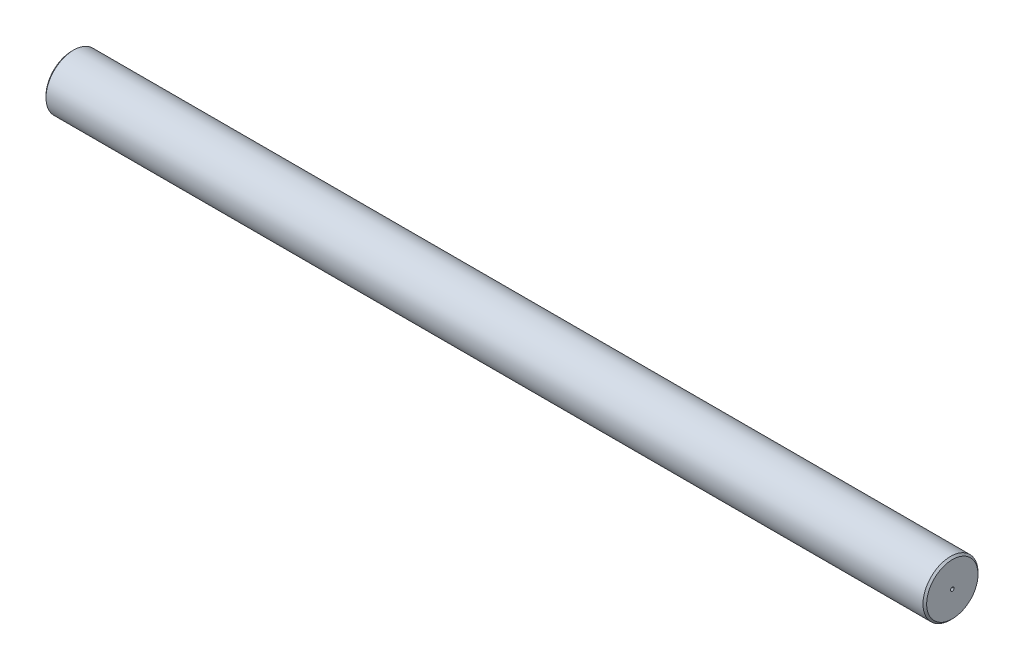
ISO-10303-21;
HEADER;
FILE_DESCRIPTION(('STEP AP214'),'2;1');
FILE_NAME('part.step','',(''),(''),'','','');
FILE_SCHEMA(('AUTOMOTIVE_DESIGN { 1 0 10303 214 1 1 1 1 }'));
ENDSEC;
DATA;
#1=APPLICATION_CONTEXT('core data for automotive mechanical design processes');
#2=APPLICATION_PROTOCOL_DEFINITION('international standard','automotive_design',2000,#1);
#3=PRODUCT_CONTEXT('',#1,'mechanical');
#4=PRODUCT('Part','Part','',(#3));
#5=PRODUCT_RELATED_PRODUCT_CATEGORY('part','',(#4));
#6=PRODUCT_DEFINITION_FORMATION('','',#4);
#7=PRODUCT_DEFINITION_CONTEXT('part definition',#1,'design');
#8=PRODUCT_DEFINITION('design','',#6,#7);
#9=PRODUCT_DEFINITION_SHAPE('','',#8);
#10=(LENGTH_UNIT() NAMED_UNIT(*) SI_UNIT(.MILLI.,.METRE.));
#11=(NAMED_UNIT(*) PLANE_ANGLE_UNIT() SI_UNIT($,.RADIAN.));
#12=(NAMED_UNIT(*) SI_UNIT($,.STERADIAN.) SOLID_ANGLE_UNIT());
#13=UNCERTAINTY_MEASURE_WITH_UNIT(LENGTH_MEASURE(1.E-05),#10,'distance_accuracy_value','');
#14=(GEOMETRIC_REPRESENTATION_CONTEXT(3) GLOBAL_UNCERTAINTY_ASSIGNED_CONTEXT((#13)) GLOBAL_UNIT_ASSIGNED_CONTEXT((#10,
#11,#12)) REPRESENTATION_CONTEXT('',''));
#15=CARTESIAN_POINT('',(0.,0.,0.));
#16=DIRECTION('',(0.,0.,1.));
#17=DIRECTION('',(1.,0.,0.));
#18=AXIS2_PLACEMENT_3D('',#15,#16,#17);
#19=CARTESIAN_POINT('',(240.,7.5,0.));
#20=DIRECTION('',(-1.,0.,0.));
#21=DIRECTION('',(0.,-1.,0.));
#22=AXIS2_PLACEMENT_3D('',#19,#20,#21);
#23=PLANE('',#22);
#24=CARTESIAN_POINT('',(240.,0.,0.));
#25=DIRECTION('',(-1.,0.,0.));
#26=DIRECTION('',(0.,-1.,0.));
#27=AXIS2_PLACEMENT_3D('',#24,#25,#26);
#28=CIRCLE('',#27,7.00000000000001);
#29=CARTESIAN_POINT('',(240.,-7.00000000000001,0.));
#30=VERTEX_POINT('',#29);
#31=EDGE_CURVE('E41',#30,#30,#28,.F.);
#32=ORIENTED_EDGE('',*,*,#31,.T.);
#33=EDGE_LOOP('',(#32));
#34=FACE_BOUND('',#33,.T.);
#35=CARTESIAN_POINT('',(240.,0.,0.));
#36=DIRECTION('',(-1.,0.,0.));
#37=DIRECTION('',(0.,0.,1.));
#38=AXIS2_PLACEMENT_3D('',#35,#36,#37);
#39=CIRCLE('',#38,0.5);
#40=CARTESIAN_POINT('',(240.,0.,0.5));
#41=VERTEX_POINT('',#40);
#42=EDGE_CURVE('E55',#41,#41,#39,.T.);
#43=ORIENTED_EDGE('',*,*,#42,.T.);
#44=EDGE_LOOP('',(#43));
#45=FACE_BOUND('',#44,.T.);
#46=ADVANCED_FACE('F33',(#34,#45),#23,.F.);
#47=CARTESIAN_POINT('',(0.,7.5,0.));
#48=DIRECTION('',(1.,0.,0.));
#49=DIRECTION('',(0.,1.,0.));
#50=AXIS2_PLACEMENT_3D('',#47,#48,#49);
#51=PLANE('',#50);
#52=CARTESIAN_POINT('',(0.,0.,0.));
#53=DIRECTION('',(1.,0.,0.));
#54=DIRECTION('',(0.,1.,0.));
#55=AXIS2_PLACEMENT_3D('',#52,#53,#54);
#56=CIRCLE('',#55,7.00000000000001);
#57=CARTESIAN_POINT('',(0.,7.00000000000001,0.));
#58=VERTEX_POINT('',#57);
#59=EDGE_CURVE('E11',#58,#58,#56,.F.);
#60=ORIENTED_EDGE('',*,*,#59,.T.);
#61=EDGE_LOOP('',(#60));
#62=FACE_BOUND('',#61,.T.);
#63=CARTESIAN_POINT('',(0.,0.,0.));
#64=DIRECTION('',(-1.,0.,0.));
#65=DIRECTION('',(0.,0.,1.));
#66=AXIS2_PLACEMENT_3D('',#63,#64,#65);
#67=CIRCLE('',#66,0.5);
#68=CARTESIAN_POINT('',(0.,0.,0.5));
#69=VERTEX_POINT('',#68);
#70=EDGE_CURVE('E57',#69,#69,#67,.T.);
#71=ORIENTED_EDGE('',*,*,#70,.F.);
#72=EDGE_LOOP('',(#71));
#73=FACE_BOUND('',#72,.T.);
#74=ADVANCED_FACE('F78',(#62,#73),#51,.F.);
#75=CARTESIAN_POINT('',(0.,0.,0.));
#76=DIRECTION('',(-1.,0.,0.));
#77=DIRECTION('',(0.,-1.,0.));
#78=AXIS2_PLACEMENT_3D('',#75,#76,#77);
#79=CYLINDRICAL_SURFACE('',#78,7.5);
#80=CARTESIAN_POINT('',(239.5,0.,0.));
#81=DIRECTION('',(-1.,0.,0.));
#82=DIRECTION('',(0.,-1.,0.));
#83=AXIS2_PLACEMENT_3D('',#80,#81,#82);
#84=CIRCLE('',#83,7.5);
#85=CARTESIAN_POINT('',(239.5,-7.5,0.));
#86=VERTEX_POINT('',#85);
#87=EDGE_CURVE('E65',#86,#86,#84,.T.);
#88=ORIENTED_EDGE('',*,*,#87,.T.);
#89=EDGE_LOOP('',(#88));
#90=FACE_BOUND('',#89,.T.);
#91=CARTESIAN_POINT('',(0.50000000000002,0.,0.));
#92=DIRECTION('',(1.,0.,0.));
#93=DIRECTION('',(0.,1.,0.));
#94=AXIS2_PLACEMENT_3D('',#91,#92,#93);
#95=CIRCLE('',#94,7.5);
#96=CARTESIAN_POINT('',(0.50000000000002,7.5,0.));
#97=VERTEX_POINT('',#96);
#98=EDGE_CURVE('E60',#97,#97,#95,.T.);
#99=ORIENTED_EDGE('',*,*,#98,.T.);
#100=EDGE_LOOP('',(#99));
#101=FACE_BOUND('',#100,.T.);
#102=ADVANCED_FACE('F75',(#90,#101),#79,.T.);
#103=CARTESIAN_POINT('',(0.5,0.,0.));
#104=DIRECTION('',(-1.,0.,0.));
#105=DIRECTION('',(0.,0.,1.));
#106=AXIS2_PLACEMENT_3D('',#103,#104,#105);
#107=CONICAL_SURFACE('',#106,0.,0.785398163397448);
#108=ORIENTED_EDGE('',*,*,#70,.T.);
#109=EDGE_LOOP('',(#108));
#110=FACE_BOUND('',#109,.T.);
#111=CARTESIAN_POINT('',(0.5,0.,0.));
#112=VERTEX_POINT('',#111);
#113=VERTEX_LOOP('',#112);
#114=FACE_BOUND('',#113,.T.);
#115=ADVANCED_FACE('F51',(#110,#114),#107,.F.);
#116=CARTESIAN_POINT('',(240.,0.,0.));
#117=DIRECTION('',(1.,0.,0.));
#118=DIRECTION('',(0.,0.,-1.));
#119=AXIS2_PLACEMENT_3D('',#116,#117,#118);
#120=CONICAL_SURFACE('',#119,0.5,0.785398163397448);
#121=CARTESIAN_POINT('',(239.5,0.,0.));
#122=VERTEX_POINT('',#121);
#123=VERTEX_LOOP('',#122);
#124=FACE_BOUND('',#123,.T.);
#125=ORIENTED_EDGE('',*,*,#42,.F.);
#126=EDGE_LOOP('',(#125));
#127=FACE_BOUND('',#126,.T.);
#128=ADVANCED_FACE('F47',(#124,#127),#120,.F.);
#129=CARTESIAN_POINT('',(239.5,0.,0.));
#130=DIRECTION('',(-1.,0.,0.));
#131=DIRECTION('',(0.,-1.,0.));
#132=AXIS2_PLACEMENT_3D('',#129,#130,#131);
#133=CONICAL_SURFACE('',#132,7.5,0.785398163397442);
#134=ORIENTED_EDGE('',*,*,#31,.F.);
#135=EDGE_LOOP('',(#134));
#136=FACE_BOUND('',#135,.T.);
#137=ORIENTED_EDGE('',*,*,#87,.F.);
#138=EDGE_LOOP('',(#137));
#139=FACE_BOUND('',#138,.T.);
#140=ADVANCED_FACE('F50',(#136,#139),#133,.T.);
#141=CARTESIAN_POINT('',(0.,0.,0.));
#142=DIRECTION('',(1.,0.,0.));
#143=DIRECTION('',(0.,1.,0.));
#144=AXIS2_PLACEMENT_3D('',#141,#142,#143);
#145=CONICAL_SURFACE('',#144,7.00000000000001,0.785398163397423);
#146=CARTESIAN_POINT('',(0.50000000000002,7.5,0.));
#147=CARTESIAN_POINT('',(0.494791666666686,7.49479166666667,0.));
#148=CARTESIAN_POINT('',(0.489583333333353,7.48958333333333,0.));
#149=CARTESIAN_POINT('',(0.479166666666686,7.47916666666667,0.));
#150=CARTESIAN_POINT('',(0.473958333333352,7.47395833333333,0.));
#151=CARTESIAN_POINT('',(0.463541666666685,7.46354166666667,0.));
#152=CARTESIAN_POINT('',(0.458333333333352,7.45833333333333,0.));
#153=CARTESIAN_POINT('',(0.447916666666685,7.44791666666667,0.));
#154=CARTESIAN_POINT('',(0.442708333333351,7.44270833333333,0.));
#155=CARTESIAN_POINT('',(0.432291666666684,7.43229166666667,0.));
#156=CARTESIAN_POINT('',(0.42708333333335,7.42708333333333,0.));
#157=CARTESIAN_POINT('',(0.416666666666683,7.41666666666667,0.));
#158=CARTESIAN_POINT('',(0.41145833333335,7.41145833333333,0.));
#159=CARTESIAN_POINT('',(0.401041666666683,7.40104166666667,0.));
#160=CARTESIAN_POINT('',(0.395833333333349,7.39583333333333,0.));
#161=CARTESIAN_POINT('',(0.385416666666682,7.38541666666667,0.));
#162=CARTESIAN_POINT('',(0.380208333333348,7.38020833333333,0.));
#163=CARTESIAN_POINT('',(0.369791666666681,7.36979166666667,0.));
#164=CARTESIAN_POINT('',(0.364583333333348,7.36458333333333,0.));
#165=CARTESIAN_POINT('',(0.354166666666681,7.35416666666667,0.));
#166=CARTESIAN_POINT('',(0.348958333333347,7.34895833333333,0.));
#167=CARTESIAN_POINT('',(0.33854166666668,7.33854166666667,0.));
#168=CARTESIAN_POINT('',(0.333333333333347,7.33333333333333,0.));
#169=CARTESIAN_POINT('',(0.322916666666679,7.32291666666667,0.));
#170=CARTESIAN_POINT('',(0.317708333333346,7.31770833333334,0.));
#171=CARTESIAN_POINT('',(0.307291666666679,7.30729166666667,0.));
#172=CARTESIAN_POINT('',(0.302083333333345,7.30208333333334,0.));
#173=CARTESIAN_POINT('',(0.291666666666678,7.29166666666667,0.));
#174=CARTESIAN_POINT('',(0.286458333333345,7.28645833333334,0.));
#175=CARTESIAN_POINT('',(0.276041666666678,7.27604166666667,0.));
#176=CARTESIAN_POINT('',(0.270833333333344,7.27083333333334,0.));
#177=CARTESIAN_POINT('',(0.260416666666677,7.26041666666667,0.));
#178=CARTESIAN_POINT('',(0.255208333333343,7.25520833333334,0.));
#179=CARTESIAN_POINT('',(0.244791666666676,7.24479166666667,0.));
#180=CARTESIAN_POINT('',(0.239583333333343,7.23958333333334,0.));
#181=CARTESIAN_POINT('',(0.229166666666676,7.22916666666667,0.));
#182=CARTESIAN_POINT('',(0.223958333333342,7.22395833333334,0.));
#183=CARTESIAN_POINT('',(0.213541666666675,7.21354166666667,0.));
#184=CARTESIAN_POINT('',(0.208333333333342,7.20833333333334,0.));
#185=CARTESIAN_POINT('',(0.197916666666675,7.19791666666667,0.));
#186=CARTESIAN_POINT('',(0.192708333333341,7.19270833333334,0.));
#187=CARTESIAN_POINT('',(0.182291666666674,7.18229166666667,0.));
#188=CARTESIAN_POINT('',(0.17708333333334,7.17708333333334,0.));
#189=CARTESIAN_POINT('',(0.166666666666673,7.16666666666667,0.));
#190=CARTESIAN_POINT('',(0.16145833333334,7.16145833333334,0.));
#191=CARTESIAN_POINT('',(0.151041666666673,7.15104166666667,0.));
#192=CARTESIAN_POINT('',(0.145833333333339,7.14583333333334,0.));
#193=CARTESIAN_POINT('',(0.135416666666672,7.13541666666667,0.));
#194=CARTESIAN_POINT('',(0.130208333333339,7.13020833333334,0.));
#195=CARTESIAN_POINT('',(0.119791666666672,7.11979166666667,0.));
#196=CARTESIAN_POINT('',(0.114583333333338,7.11458333333334,0.));
#197=CARTESIAN_POINT('',(0.104166666666671,7.10416666666667,0.));
#198=CARTESIAN_POINT('',(0.0989583333333374,7.09895833333334,0.));
#199=CARTESIAN_POINT('',(0.0885416666666703,7.08854166666667,0.));
#200=CARTESIAN_POINT('',(0.0833333333333368,7.08333333333334,0.));
#201=CARTESIAN_POINT('',(0.0729166666666697,7.07291666666667,0.));
#202=CARTESIAN_POINT('',(0.0677083333333361,7.06770833333334,0.));
#203=CARTESIAN_POINT('',(0.0572916666666691,7.05729166666667,0.));
#204=CARTESIAN_POINT('',(0.0520833333333356,7.05208333333334,0.));
#205=CARTESIAN_POINT('',(0.0416666666666685,7.04166666666667,0.));
#206=CARTESIAN_POINT('',(0.0364583333333349,7.03645833333334,0.));
#207=CARTESIAN_POINT('',(0.0260416666666677,7.02604166666667,0.));
#208=CARTESIAN_POINT('',(0.0208333333333343,7.02083333333334,0.));
#209=CARTESIAN_POINT('',(0.0104166666666673,7.01041666666667,0.));
#210=CARTESIAN_POINT('',(0.00520833333333378,7.00520833333334,0.));
#211=CARTESIAN_POINT('',(0.,7.00000000000001,0.));
#212=B_SPLINE_CURVE_WITH_KNOTS('',3,(#146,#147,#148,#149,#150,#151,#152,#153,#154,#155,#156,
#157,#158,#159,#160,#161,#162,#163,#164,#165,#166,#167,#168,#169,#170,#171,#172,#173,#174,#175,
#176,#177,#178,#179,#180,#181,#182,#183,#184,#185,#186,#187,#188,#189,#190,#191,#192,#193,#194,
#195,#196,#197,#198,#199,#200,#201,#202,#203,#204,#205,#206,#207,#208,#209,#210,#211),
.UNSPECIFIED.,.F.,.F.,(4,2,2,2,2,2,2,2,2,2,2,2,2,2,2,2,2,2,2,2,2,2,2,2,2,2,2,2,2,2,2,2,4),(0.,
0.02209708691208,0.0441941738241594,0.0662912607362395,0.0883883476483195,0.1104854345604,
0.13258252147248,0.154679608384559,0.176776695296639,0.198873782208719,0.220970869120799,
0.243067956032879,0.265165042944959,0.287262129857039,0.309359216769119,0.331456303681199,
0.353553390593278,0.375650477505358,0.397747564417438,0.419844651329519,0.441941738241599,
0.464038825153678,0.486135912065758,0.508232998977838,0.530330085889918,0.552427172801998,
0.574524259714078,0.596621346626158,0.618718433538238,0.640815520450318,0.662912607362397,
0.685009694274478,0.707106781186558),.UNSPECIFIED.);
#213=EDGE_CURVE('BSEAM35',#97,#58,#212,.T.);
#214=ORIENTED_EDGE('',*,*,#98,.F.);
#215=ORIENTED_EDGE('',*,*,#59,.F.);
#216=ORIENTED_EDGE('',*,*,#213,.T.);
#217=ORIENTED_EDGE('',*,*,#213,.F.);
#218=EDGE_LOOP('',(#214,#216,#215,#217));
#219=FACE_BOUND('',#218,.T.);
#220=ADVANCED_FACE('F35',(#219),#145,.T.);
#221=CLOSED_SHELL('',(#46,#74,#102,#115,#128,#140,#220));
#222=MANIFOLD_SOLID_BREP('B2',#221);
#223=ADVANCED_BREP_SHAPE_REPRESENTATION('',(#18,#222),#14);
#224=SHAPE_DEFINITION_REPRESENTATION(#9,#223);
ENDSEC;
END-ISO-10303-21;
